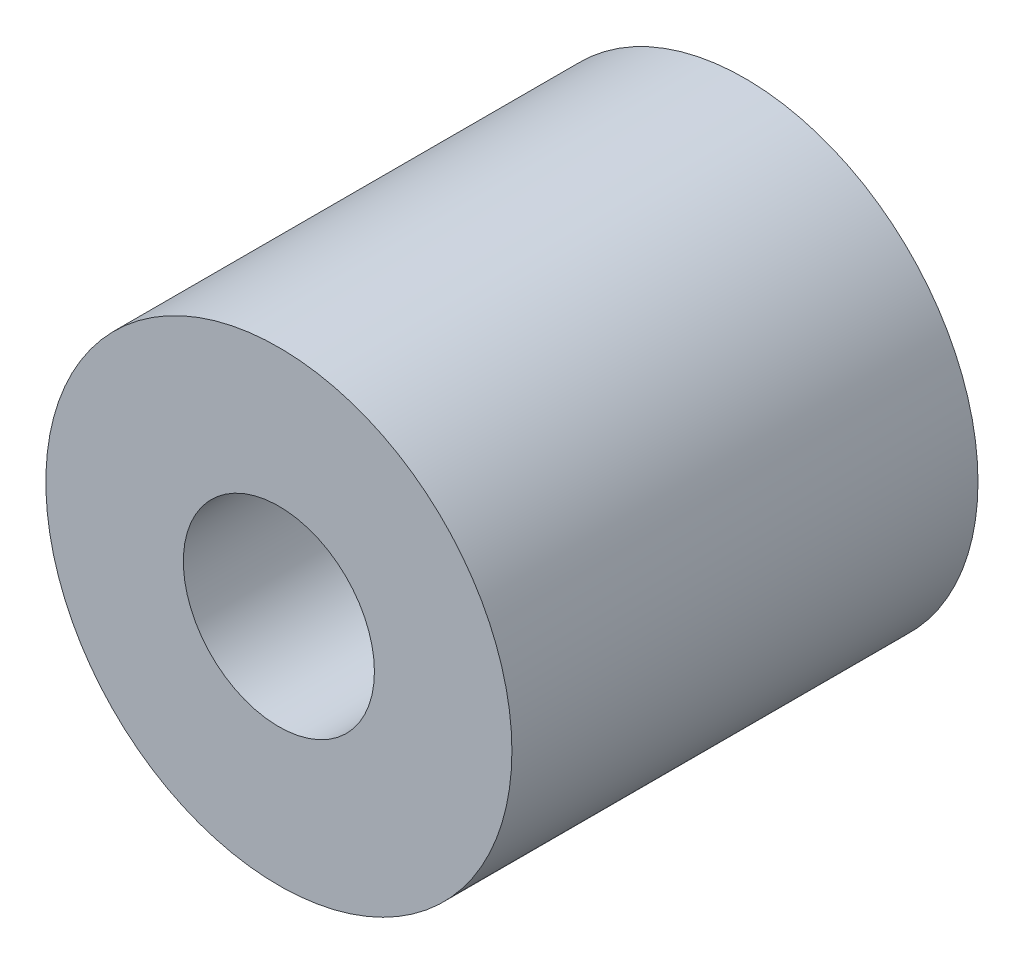
ISO-10303-21;
HEADER;
FILE_DESCRIPTION(('STEP AP214'),'2;1');
FILE_NAME('part.step','',(''),(''),'','','');
FILE_SCHEMA(('AUTOMOTIVE_DESIGN { 1 0 10303 214 1 1 1 1 }'));
ENDSEC;
DATA;
#1=APPLICATION_CONTEXT('core data for automotive mechanical design processes');
#2=APPLICATION_PROTOCOL_DEFINITION('international standard','automotive_design',2000,#1);
#3=PRODUCT_CONTEXT('',#1,'mechanical');
#4=PRODUCT('Part','Part','',(#3));
#5=PRODUCT_RELATED_PRODUCT_CATEGORY('part','',(#4));
#6=PRODUCT_DEFINITION_FORMATION('','',#4);
#7=PRODUCT_DEFINITION_CONTEXT('part definition',#1,'design');
#8=PRODUCT_DEFINITION('design','',#6,#7);
#9=PRODUCT_DEFINITION_SHAPE('','',#8);
#10=(LENGTH_UNIT() NAMED_UNIT(*) SI_UNIT(.MILLI.,.METRE.));
#11=(NAMED_UNIT(*) PLANE_ANGLE_UNIT() SI_UNIT($,.RADIAN.));
#12=(NAMED_UNIT(*) SI_UNIT($,.STERADIAN.) SOLID_ANGLE_UNIT());
#13=UNCERTAINTY_MEASURE_WITH_UNIT(LENGTH_MEASURE(1.E-05),#10,'distance_accuracy_value','');
#14=(GEOMETRIC_REPRESENTATION_CONTEXT(3) GLOBAL_UNCERTAINTY_ASSIGNED_CONTEXT((#13)) GLOBAL_UNIT_ASSIGNED_CONTEXT((#10,
#11,#12)) REPRESENTATION_CONTEXT('',''));
#15=CARTESIAN_POINT('',(0.,0.,0.));
#16=DIRECTION('',(0.,0.,1.));
#17=DIRECTION('',(1.,0.,0.));
#18=AXIS2_PLACEMENT_3D('',#15,#16,#17);
#19=CARTESIAN_POINT('',(0.,0.,6.35));
#20=DIRECTION('',(0.,0.,1.));
#21=DIRECTION('',(1.,0.,0.));
#22=AXIS2_PLACEMENT_3D('',#19,#20,#21);
#23=PLANE('',#22);
#24=CARTESIAN_POINT('',(0.,0.,6.35));
#25=DIRECTION('',(0.,0.,1.));
#26=DIRECTION('',(1.,0.,0.));
#27=AXIS2_PLACEMENT_3D('',#24,#25,#26);
#28=CIRCLE('',#27,6.35);
#29=CARTESIAN_POINT('',(6.35,0.,6.35));
#30=VERTEX_POINT('',#29);
#31=EDGE_CURVE('E10',#30,#30,#28,.T.);
#32=ORIENTED_EDGE('',*,*,#31,.T.);
#33=EDGE_LOOP('',(#32));
#34=FACE_BOUND('',#33,.T.);
#35=CARTESIAN_POINT('',(0.,0.,6.35));
#36=DIRECTION('',(0.,0.,1.));
#37=DIRECTION('',(1.,0.,0.));
#38=AXIS2_PLACEMENT_3D('',#35,#36,#37);
#39=CIRCLE('',#38,2.6035);
#40=CARTESIAN_POINT('',(2.6035,0.,6.35));
#41=VERTEX_POINT('',#40);
#42=EDGE_CURVE('E45',#41,#41,#39,.T.);
#43=ORIENTED_EDGE('',*,*,#42,.F.);
#44=EDGE_LOOP('',(#43));
#45=FACE_BOUND('',#44,.T.);
#46=ADVANCED_FACE('F34',(#34,#45),#23,.T.);
#47=CARTESIAN_POINT('',(0.,0.,-6.35));
#48=DIRECTION('',(0.,0.,1.));
#49=DIRECTION('',(1.,0.,0.));
#50=AXIS2_PLACEMENT_3D('',#47,#48,#49);
#51=PLANE('',#50);
#52=CARTESIAN_POINT('',(0.,0.,-6.35));
#53=DIRECTION('',(0.,0.,1.));
#54=DIRECTION('',(1.,0.,0.));
#55=AXIS2_PLACEMENT_3D('',#52,#53,#54);
#56=CIRCLE('',#55,6.35);
#57=CARTESIAN_POINT('',(6.35,0.,-6.35));
#58=VERTEX_POINT('',#57);
#59=EDGE_CURVE('E38',#58,#58,#56,.T.);
#60=ORIENTED_EDGE('',*,*,#59,.F.);
#61=EDGE_LOOP('',(#60));
#62=FACE_BOUND('',#61,.T.);
#63=CARTESIAN_POINT('',(0.,0.,-6.35));
#64=DIRECTION('',(0.,0.,1.));
#65=DIRECTION('',(1.,0.,0.));
#66=AXIS2_PLACEMENT_3D('',#63,#64,#65);
#67=CIRCLE('',#66,2.6035);
#68=CARTESIAN_POINT('',(2.6035,0.,-6.35));
#69=VERTEX_POINT('',#68);
#70=EDGE_CURVE('E47',#69,#69,#67,.T.);
#71=ORIENTED_EDGE('',*,*,#70,.T.);
#72=EDGE_LOOP('',(#71));
#73=FACE_BOUND('',#72,.T.);
#74=ADVANCED_FACE('F57',(#62,#73),#51,.F.);
#75=CARTESIAN_POINT('',(0.,0.,6.35));
#76=DIRECTION('',(0.,0.,-1.));
#77=DIRECTION('',(-1.,0.,0.));
#78=AXIS2_PLACEMENT_3D('',#75,#76,#77);
#79=CYLINDRICAL_SURFACE('',#78,6.35);
#80=ORIENTED_EDGE('',*,*,#31,.F.);
#81=EDGE_LOOP('',(#80));
#82=FACE_BOUND('',#81,.T.);
#83=ORIENTED_EDGE('',*,*,#59,.T.);
#84=EDGE_LOOP('',(#83));
#85=FACE_BOUND('',#84,.T.);
#86=ADVANCED_FACE('F36',(#82,#85),#79,.T.);
#87=CARTESIAN_POINT('',(0.,0.,6.35));
#88=DIRECTION('',(0.,0.,-1.));
#89=DIRECTION('',(-1.,0.,0.));
#90=AXIS2_PLACEMENT_3D('',#87,#88,#89);
#91=CYLINDRICAL_SURFACE('',#90,2.6035);
#92=ORIENTED_EDGE('',*,*,#42,.T.);
#93=EDGE_LOOP('',(#92));
#94=FACE_BOUND('',#93,.T.);
#95=ORIENTED_EDGE('',*,*,#70,.F.);
#96=EDGE_LOOP('',(#95));
#97=FACE_BOUND('',#96,.T.);
#98=ADVANCED_FACE('F53',(#94,#97),#91,.F.);
#99=CLOSED_SHELL('',(#46,#74,#86,#98));
#100=MANIFOLD_SOLID_BREP('B2',#99);
#101=ADVANCED_BREP_SHAPE_REPRESENTATION('',(#18,#100),#14);
#102=SHAPE_DEFINITION_REPRESENTATION(#9,#101);
ENDSEC;
END-ISO-10303-21;
